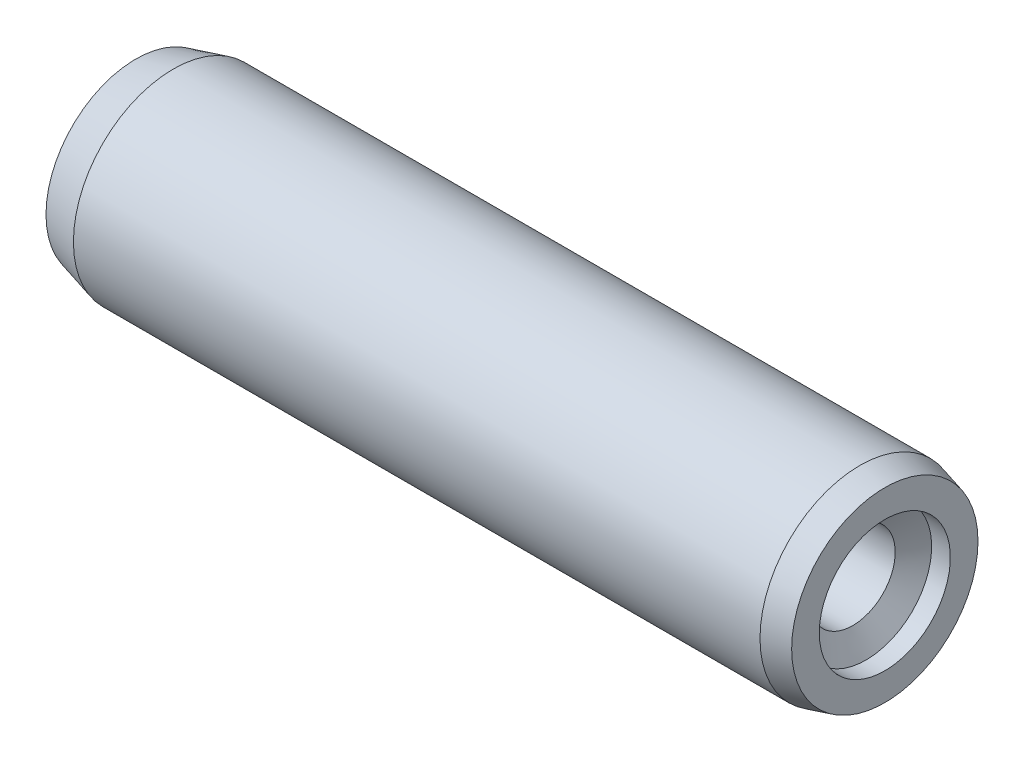
ISO-10303-21;
HEADER;
FILE_DESCRIPTION(('STEP AP214'),'2;1');
FILE_NAME('part.step','',(''),(''),'','','');
FILE_SCHEMA(('AUTOMOTIVE_DESIGN { 1 0 10303 214 1 1 1 1 }'));
ENDSEC;
DATA;
#1=APPLICATION_CONTEXT('core data for automotive mechanical design processes');
#2=APPLICATION_PROTOCOL_DEFINITION('international standard','automotive_design',2000,#1);
#3=PRODUCT_CONTEXT('',#1,'mechanical');
#4=PRODUCT('Part','Part','',(#3));
#5=PRODUCT_RELATED_PRODUCT_CATEGORY('part','',(#4));
#6=PRODUCT_DEFINITION_FORMATION('','',#4);
#7=PRODUCT_DEFINITION_CONTEXT('part definition',#1,'design');
#8=PRODUCT_DEFINITION('design','',#6,#7);
#9=PRODUCT_DEFINITION_SHAPE('','',#8);
#10=(LENGTH_UNIT() NAMED_UNIT(*) SI_UNIT(.MILLI.,.METRE.));
#11=(NAMED_UNIT(*) PLANE_ANGLE_UNIT() SI_UNIT($,.RADIAN.));
#12=(NAMED_UNIT(*) SI_UNIT($,.STERADIAN.) SOLID_ANGLE_UNIT());
#13=UNCERTAINTY_MEASURE_WITH_UNIT(LENGTH_MEASURE(1.E-05),#10,'distance_accuracy_value','');
#14=(GEOMETRIC_REPRESENTATION_CONTEXT(3) GLOBAL_UNCERTAINTY_ASSIGNED_CONTEXT((#13)) GLOBAL_UNIT_ASSIGNED_CONTEXT((#10,
#11,#12)) REPRESENTATION_CONTEXT('',''));
#15=CARTESIAN_POINT('',(0.,0.,0.));
#16=DIRECTION('',(0.,0.,1.));
#17=DIRECTION('',(1.,0.,0.));
#18=AXIS2_PLACEMENT_3D('',#15,#16,#17);
#19=CARTESIAN_POINT('',(60.,7.46410161513776,0.));
#20=DIRECTION('',(-1.,0.,0.));
#21=DIRECTION('',(0.,0.,1.));
#22=AXIS2_PLACEMENT_3D('',#19,#20,#21);
#23=PLANE('',#22);
#24=CARTESIAN_POINT('',(60.,0.,0.));
#25=DIRECTION('',(-1.,0.,0.));
#26=DIRECTION('',(0.,0.,1.));
#27=AXIS2_PLACEMENT_3D('',#24,#25,#26);
#28=CIRCLE('',#27,7.46410161513776);
#29=CARTESIAN_POINT('',(60.,0.,7.46410161513776));
#30=VERTEX_POINT('',#29);
#31=EDGE_CURVE('E70',#30,#30,#28,.T.);
#32=ORIENTED_EDGE('',*,*,#31,.F.);
#33=EDGE_LOOP('',(#32));
#34=FACE_BOUND('',#33,.T.);
#35=CARTESIAN_POINT('',(60.,0.,0.));
#36=DIRECTION('',(-1.,0.,0.));
#37=DIRECTION('',(0.,0.,1.));
#38=AXIS2_PLACEMENT_3D('',#35,#36,#37);
#39=CIRCLE('',#38,5.25);
#40=CARTESIAN_POINT('',(60.,0.,5.25));
#41=VERTEX_POINT('',#40);
#42=EDGE_CURVE('E11',#41,#41,#39,.T.);
#43=ORIENTED_EDGE('',*,*,#42,.T.);
#44=EDGE_LOOP('',(#43));
#45=FACE_BOUND('',#44,.T.);
#46=ADVANCED_FACE('F34',(#34,#45),#23,.F.);
#47=CARTESIAN_POINT('',(0.,0.,0.));
#48=DIRECTION('',(-1.,0.,0.));
#49=DIRECTION('',(0.,0.,1.));
#50=AXIS2_PLACEMENT_3D('',#47,#48,#49);
#51=CYLINDRICAL_SURFACE('',#50,5.25);
#52=ORIENTED_EDGE('',*,*,#42,.F.);
#53=EDGE_LOOP('',(#52));
#54=FACE_BOUND('',#53,.T.);
#55=CARTESIAN_POINT('',(58.5,0.,0.));
#56=DIRECTION('',(-1.,0.,0.));
#57=DIRECTION('',(0.,0.,1.));
#58=AXIS2_PLACEMENT_3D('',#55,#56,#57);
#59=CIRCLE('',#58,5.25);
#60=CARTESIAN_POINT('',(58.5,0.,5.25));
#61=VERTEX_POINT('',#60);
#62=EDGE_CURVE('E40',#61,#61,#59,.T.);
#63=ORIENTED_EDGE('',*,*,#62,.T.);
#64=EDGE_LOOP('',(#63));
#65=FACE_BOUND('',#64,.T.);
#66=ADVANCED_FACE('F61',(#54,#65),#51,.F.);
#67=CARTESIAN_POINT('',(57.4319020019992,0.,0.));
#68=DIRECTION('',(1.,0.,0.));
#69=DIRECTION('',(0.,0.,-1.));
#70=AXIS2_PLACEMENT_3D('',#67,#68,#69);
#71=CONICAL_SURFACE('',#70,3.4,1.0471975511966);
#72=ORIENTED_EDGE('',*,*,#62,.F.);
#73=EDGE_LOOP('',(#72));
#74=FACE_BOUND('',#73,.T.);
#75=CARTESIAN_POINT('',(57.4319020019992,0.,0.));
#76=DIRECTION('',(-1.,0.,0.));
#77=DIRECTION('',(0.,0.,1.));
#78=AXIS2_PLACEMENT_3D('',#75,#76,#77);
#79=CIRCLE('',#78,3.4);
#80=CARTESIAN_POINT('',(57.4319020019992,0.,3.4));
#81=VERTEX_POINT('',#80);
#82=EDGE_CURVE('E76',#81,#81,#79,.T.);
#83=ORIENTED_EDGE('',*,*,#82,.T.);
#84=EDGE_LOOP('',(#83));
#85=FACE_BOUND('',#84,.T.);
#86=ADVANCED_FACE('F56',(#74,#85),#71,.F.);
#87=CARTESIAN_POINT('',(0.,0.,0.));
#88=DIRECTION('',(-1.,0.,0.));
#89=DIRECTION('',(0.,0.,1.));
#90=AXIS2_PLACEMENT_3D('',#87,#88,#89);
#91=CYLINDRICAL_SURFACE('',#90,3.4);
#92=ORIENTED_EDGE('',*,*,#82,.F.);
#93=EDGE_LOOP('',(#92));
#94=FACE_BOUND('',#93,.T.);
#95=CARTESIAN_POINT('',(35.,0.,0.));
#96=DIRECTION('',(-1.,0.,0.));
#97=DIRECTION('',(0.,0.,1.));
#98=AXIS2_PLACEMENT_3D('',#95,#96,#97);
#99=CIRCLE('',#98,3.4);
#100=CARTESIAN_POINT('',(35.,0.,3.4));
#101=VERTEX_POINT('',#100);
#102=EDGE_CURVE('E78',#101,#101,#99,.T.);
#103=ORIENTED_EDGE('',*,*,#102,.T.);
#104=EDGE_LOOP('',(#103));
#105=FACE_BOUND('',#104,.T.);
#106=ADVANCED_FACE('F46',(#94,#105),#91,.F.);
#107=CARTESIAN_POINT('',(33.5916738879315,0.,0.));
#108=DIRECTION('',(1.,0.,0.));
#109=DIRECTION('',(0.,0.,-1.));
#110=AXIS2_PLACEMENT_3D('',#107,#108,#109);
#111=CONICAL_SURFACE('',#110,0.,1.17809724509617);
#112=ORIENTED_EDGE('',*,*,#102,.F.);
#113=EDGE_LOOP('',(#112));
#114=FACE_BOUND('',#113,.T.);
#115=CARTESIAN_POINT('',(33.5916738879315,0.,0.));
#116=VERTEX_POINT('',#115);
#117=VERTEX_LOOP('',#116);
#118=FACE_BOUND('',#117,.T.);
#119=ADVANCED_FACE('F43',(#114,#118),#111,.F.);
#120=CARTESIAN_POINT('',(0.,0.,0.));
#121=DIRECTION('',(1.,0.,0.));
#122=DIRECTION('',(0.,0.,-1.));
#123=AXIS2_PLACEMENT_3D('',#120,#121,#122);
#124=PLANE('',#123);
#125=CARTESIAN_POINT('',(0.,0.,0.));
#126=DIRECTION('',(-1.,0.,0.));
#127=DIRECTION('',(0.,0.,1.));
#128=AXIS2_PLACEMENT_3D('',#125,#126,#127);
#129=CIRCLE('',#128,7.19615242270665);
#130=CARTESIAN_POINT('',(0.,0.,7.19615242270665));
#131=VERTEX_POINT('',#130);
#132=EDGE_CURVE('E83',#131,#131,#129,.T.);
#133=ORIENTED_EDGE('',*,*,#132,.T.);
#134=EDGE_LOOP('',(#133));
#135=FACE_BOUND('',#134,.T.);
#136=ADVANCED_FACE('F45',(#135),#124,.F.);
#137=CARTESIAN_POINT('',(3.,0.,0.));
#138=DIRECTION('',(1.,0.,0.));
#139=DIRECTION('',(0.,0.,-1.));
#140=AXIS2_PLACEMENT_3D('',#137,#138,#139);
#141=CONICAL_SURFACE('',#140,8.,0.261799387799143);
#142=ORIENTED_EDGE('',*,*,#132,.F.);
#143=EDGE_LOOP('',(#142));
#144=FACE_BOUND('',#143,.T.);
#145=CARTESIAN_POINT('',(3.,0.,0.));
#146=DIRECTION('',(-1.,0.,0.));
#147=DIRECTION('',(0.,0.,1.));
#148=AXIS2_PLACEMENT_3D('',#145,#146,#147);
#149=CIRCLE('',#148,8.);
#150=CARTESIAN_POINT('',(3.,0.,8.));
#151=VERTEX_POINT('',#150);
#152=EDGE_CURVE('E86',#151,#151,#149,.T.);
#153=ORIENTED_EDGE('',*,*,#152,.T.);
#154=EDGE_LOOP('',(#153));
#155=FACE_BOUND('',#154,.T.);
#156=ADVANCED_FACE('F53',(#144,#155),#141,.T.);
#157=CARTESIAN_POINT('',(0.,0.,0.));
#158=DIRECTION('',(-1.,0.,0.));
#159=DIRECTION('',(0.,0.,1.));
#160=AXIS2_PLACEMENT_3D('',#157,#158,#159);
#161=CYLINDRICAL_SURFACE('',#160,8.);
#162=ORIENTED_EDGE('',*,*,#152,.F.);
#163=EDGE_LOOP('',(#162));
#164=FACE_BOUND('',#163,.T.);
#165=CARTESIAN_POINT('',(58.,0.,0.));
#166=DIRECTION('',(-1.,0.,0.));
#167=DIRECTION('',(0.,0.,1.));
#168=AXIS2_PLACEMENT_3D('',#165,#166,#167);
#169=CIRCLE('',#168,8.);
#170=CARTESIAN_POINT('',(58.,0.,8.));
#171=VERTEX_POINT('',#170);
#172=EDGE_CURVE('E89',#171,#171,#169,.T.);
#173=ORIENTED_EDGE('',*,*,#172,.T.);
#174=EDGE_LOOP('',(#173));
#175=FACE_BOUND('',#174,.T.);
#176=ADVANCED_FACE('F95',(#164,#175),#161,.T.);
#177=CARTESIAN_POINT('',(60.,0.,0.));
#178=DIRECTION('',(-1.,0.,0.));
#179=DIRECTION('',(0.,0.,1.));
#180=AXIS2_PLACEMENT_3D('',#177,#178,#179);
#181=CONICAL_SURFACE('',#180,7.46410161513776,0.261799387799146);
#182=ORIENTED_EDGE('',*,*,#172,.F.);
#183=EDGE_LOOP('',(#182));
#184=FACE_BOUND('',#183,.T.);
#185=ORIENTED_EDGE('',*,*,#31,.T.);
#186=EDGE_LOOP('',(#185));
#187=FACE_BOUND('',#186,.T.);
#188=ADVANCED_FACE('F93',(#184,#187),#181,.T.);
#189=CLOSED_SHELL('',(#46,#66,#86,#106,#119,#136,#156,#176,#188));
#190=MANIFOLD_SOLID_BREP('B2',#189);
#191=ADVANCED_BREP_SHAPE_REPRESENTATION('',(#18,#190),#14);
#192=SHAPE_DEFINITION_REPRESENTATION(#9,#191);
ENDSEC;
END-ISO-10303-21;
